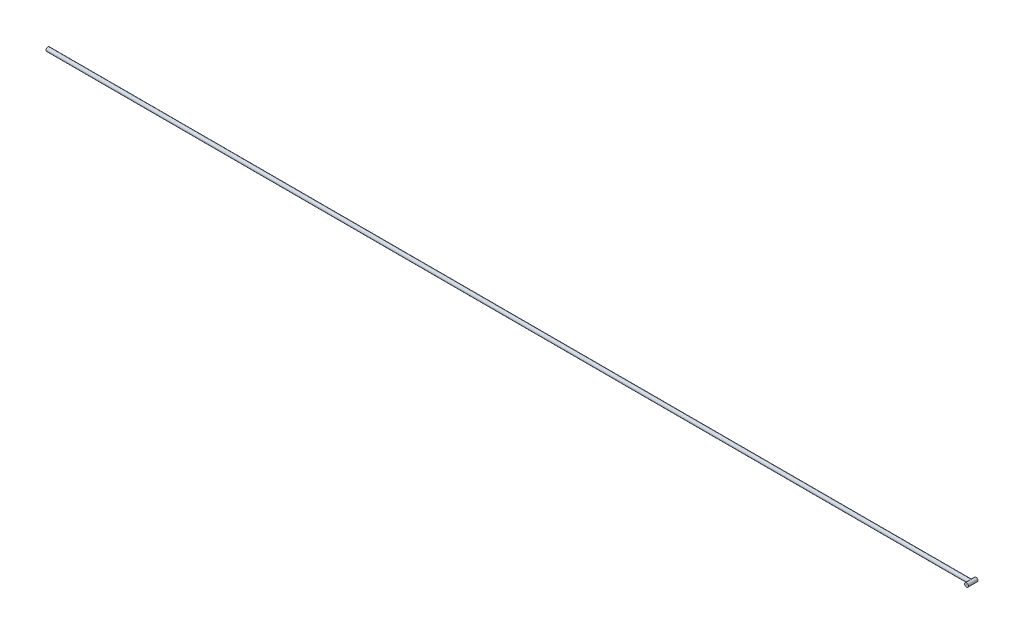
ISO-10303-21;
HEADER;
FILE_DESCRIPTION(('STEP AP214'),'2;1');
FILE_NAME('part.step','',(''),(''),'','','');
FILE_SCHEMA(('AUTOMOTIVE_DESIGN { 1 0 10303 214 1 1 1 1 }'));
ENDSEC;
DATA;
#1=APPLICATION_CONTEXT('core data for automotive mechanical design processes');
#2=APPLICATION_PROTOCOL_DEFINITION('international standard','automotive_design',2000,#1);
#3=PRODUCT_CONTEXT('',#1,'mechanical');
#4=PRODUCT('Part','Part','',(#3));
#5=PRODUCT_RELATED_PRODUCT_CATEGORY('part','',(#4));
#6=PRODUCT_DEFINITION_FORMATION('','',#4);
#7=PRODUCT_DEFINITION_CONTEXT('part definition',#1,'design');
#8=PRODUCT_DEFINITION('design','',#6,#7);
#9=PRODUCT_DEFINITION_SHAPE('','',#8);
#10=(LENGTH_UNIT() NAMED_UNIT(*) SI_UNIT(.MILLI.,.METRE.));
#11=(NAMED_UNIT(*) PLANE_ANGLE_UNIT() SI_UNIT($,.RADIAN.));
#12=(NAMED_UNIT(*) SI_UNIT($,.STERADIAN.) SOLID_ANGLE_UNIT());
#13=UNCERTAINTY_MEASURE_WITH_UNIT(LENGTH_MEASURE(1.E-05),#10,'distance_accuracy_value','');
#14=(GEOMETRIC_REPRESENTATION_CONTEXT(3) GLOBAL_UNCERTAINTY_ASSIGNED_CONTEXT((#13)) GLOBAL_UNIT_ASSIGNED_CONTEXT((#10,
#11,#12)) REPRESENTATION_CONTEXT('',''));
#15=CARTESIAN_POINT('',(0.,0.,0.));
#16=DIRECTION('',(0.,0.,1.));
#17=DIRECTION('',(1.,0.,0.));
#18=AXIS2_PLACEMENT_3D('',#15,#16,#17);
#19=CARTESIAN_POINT('',(-240.,0.,0.));
#20=DIRECTION('',(1.,0.,0.));
#21=DIRECTION('',(0.,0.,-1.));
#22=AXIS2_PLACEMENT_3D('',#19,#20,#21);
#23=PLANE('',#22);
#24=CARTESIAN_POINT('',(-240.,0.,0.));
#25=DIRECTION('',(1.,0.,0.));
#26=DIRECTION('',(0.,0.,-1.));
#27=AXIS2_PLACEMENT_3D('',#24,#25,#26);
#28=CIRCLE('',#27,1.);
#29=CARTESIAN_POINT('',(-240.,0.,-1.));
#30=VERTEX_POINT('',#29);
#31=EDGE_CURVE('E71',#30,#30,#28,.T.);
#32=ORIENTED_EDGE('',*,*,#31,.F.);
#33=EDGE_LOOP('',(#32));
#34=FACE_BOUND('',#33,.T.);
#35=ADVANCED_FACE('F51',(#34),#23,.F.);
#36=CARTESIAN_POINT('',(-240.,0.,0.));
#37=DIRECTION('',(1.,0.,0.));
#38=DIRECTION('',(0.,0.,-1.));
#39=AXIS2_PLACEMENT_3D('',#36,#37,#38);
#40=CYLINDRICAL_SURFACE('',#39,1.);
#41=CARTESIAN_POINT('',(240.,0.,0.));
#42=DIRECTION('',(0.707106781186547,0.,-0.707106781186547));
#43=DIRECTION('',(0.707106781186547,0.,0.707106781186547));
#44=AXIS2_PLACEMENT_3D('',#41,#42,#43);
#45=ELLIPSE('',#44,1.4142135623731,1.);
#46=CARTESIAN_POINT('',(240.,-1.,0.));
#47=VERTEX_POINT('',#46);
#48=CARTESIAN_POINT('',(240.,1.,0.));
#49=VERTEX_POINT('',#48);
#50=EDGE_CURVE('E12',#47,#49,#45,.T.);
#51=ORIENTED_EDGE('',*,*,#50,.F.);
#52=CARTESIAN_POINT('',(240.,0.,0.));
#53=DIRECTION('',(0.707106781186547,0.,0.707106781186547));
#54=DIRECTION('',(0.707106781186547,0.,-0.707106781186547));
#55=AXIS2_PLACEMENT_3D('',#52,#53,#54);
#56=ELLIPSE('',#55,1.4142135623731,1.);
#57=EDGE_CURVE('E59',#49,#47,#56,.T.);
#58=ORIENTED_EDGE('',*,*,#57,.F.);
#59=EDGE_LOOP('',(#51,#58));
#60=FACE_BOUND('',#59,.T.);
#61=ORIENTED_EDGE('',*,*,#31,.T.);
#62=EDGE_LOOP('',(#61));
#63=FACE_BOUND('',#62,.T.);
#64=ADVANCED_FACE('F65',(#60,#63),#40,.T.);
#65=CARTESIAN_POINT('',(240.,0.,2.5));
#66=DIRECTION('',(0.,0.,-1.));
#67=DIRECTION('',(-1.,0.,0.));
#68=AXIS2_PLACEMENT_3D('',#65,#66,#67);
#69=PLANE('',#68);
#70=CARTESIAN_POINT('',(240.,0.,2.5));
#71=DIRECTION('',(0.,0.,-1.));
#72=DIRECTION('',(-1.,0.,0.));
#73=AXIS2_PLACEMENT_3D('',#70,#71,#72);
#74=CIRCLE('',#73,1.);
#75=CARTESIAN_POINT('',(239.,0.,2.5));
#76=VERTEX_POINT('',#75);
#77=EDGE_CURVE('E80',#76,#76,#74,.T.);
#78=ORIENTED_EDGE('',*,*,#77,.F.);
#79=EDGE_LOOP('',(#78));
#80=FACE_BOUND('',#79,.T.);
#81=ADVANCED_FACE('F86',(#80),#69,.F.);
#82=CARTESIAN_POINT('',(240.,0.,-2.5));
#83=DIRECTION('',(0.,0.,-1.));
#84=DIRECTION('',(-1.,0.,0.));
#85=AXIS2_PLACEMENT_3D('',#82,#83,#84);
#86=PLANE('',#85);
#87=CARTESIAN_POINT('',(240.,0.,-2.5));
#88=DIRECTION('',(0.,0.,-1.));
#89=DIRECTION('',(-1.,0.,0.));
#90=AXIS2_PLACEMENT_3D('',#87,#88,#89);
#91=CIRCLE('',#90,1.);
#92=CARTESIAN_POINT('',(239.,0.,-2.5));
#93=VERTEX_POINT('',#92);
#94=EDGE_CURVE('E74',#93,#93,#91,.T.);
#95=ORIENTED_EDGE('',*,*,#94,.T.);
#96=EDGE_LOOP('',(#95));
#97=FACE_BOUND('',#96,.T.);
#98=ADVANCED_FACE('F88',(#97),#86,.T.);
#99=CARTESIAN_POINT('',(240.,0.,2.5));
#100=DIRECTION('',(0.,0.,-1.));
#101=DIRECTION('',(-1.,0.,0.));
#102=AXIS2_PLACEMENT_3D('',#99,#100,#101);
#103=CYLINDRICAL_SURFACE('',#102,1.);
#104=ORIENTED_EDGE('',*,*,#57,.T.);
#105=ORIENTED_EDGE('',*,*,#50,.T.);
#106=EDGE_LOOP('',(#104,#105));
#107=FACE_BOUND('',#106,.T.);
#108=ORIENTED_EDGE('',*,*,#94,.F.);
#109=EDGE_LOOP('',(#108));
#110=FACE_BOUND('',#109,.T.);
#111=ORIENTED_EDGE('',*,*,#77,.T.);
#112=EDGE_LOOP('',(#111));
#113=FACE_BOUND('',#112,.T.);
#114=ADVANCED_FACE('F68',(#107,#110,#113),#103,.T.);
#115=CLOSED_SHELL('',(#35,#64,#81,#98,#114));
#116=MANIFOLD_SOLID_BREP('B2',#115);
#117=ADVANCED_BREP_SHAPE_REPRESENTATION('',(#18,#116),#14);
#118=SHAPE_DEFINITION_REPRESENTATION(#9,#117);
ENDSEC;
END-ISO-10303-21;
